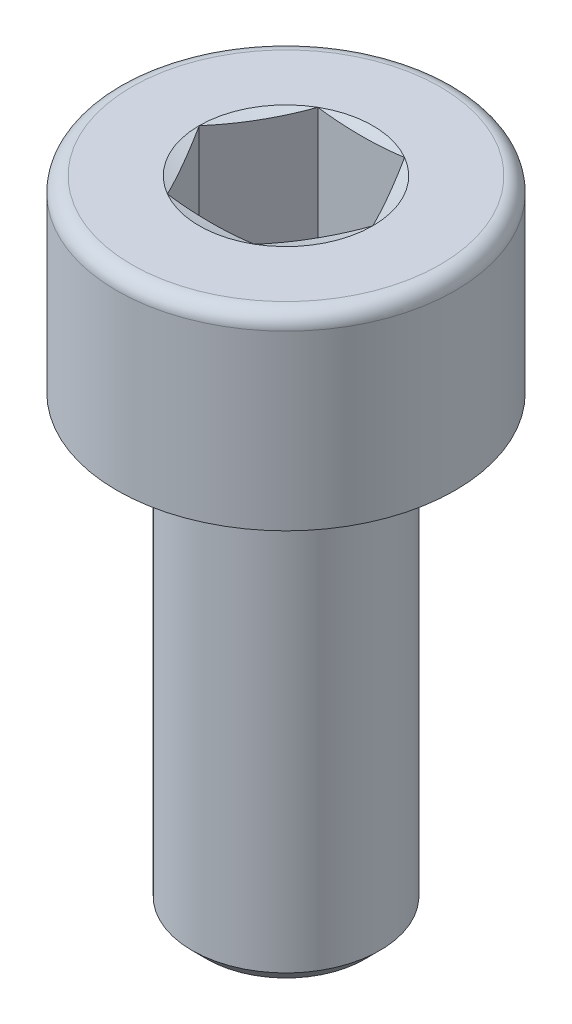
ISO-10303-21;
HEADER;
FILE_DESCRIPTION(('STEP AP214'),'2;1');
FILE_NAME('part.step','',(''),(''),'','','');
FILE_SCHEMA(('AUTOMOTIVE_DESIGN { 1 0 10303 214 1 1 1 1 }'));
ENDSEC;
DATA;
#1=APPLICATION_CONTEXT('core data for automotive mechanical design processes');
#2=APPLICATION_PROTOCOL_DEFINITION('international standard','automotive_design',2000,#1);
#3=PRODUCT_CONTEXT('',#1,'mechanical');
#4=PRODUCT('Part','Part','',(#3));
#5=PRODUCT_RELATED_PRODUCT_CATEGORY('part','',(#4));
#6=PRODUCT_DEFINITION_FORMATION('','',#4);
#7=PRODUCT_DEFINITION_CONTEXT('part definition',#1,'design');
#8=PRODUCT_DEFINITION('design','',#6,#7);
#9=PRODUCT_DEFINITION_SHAPE('','',#8);
#10=(LENGTH_UNIT() NAMED_UNIT(*) SI_UNIT(.MILLI.,.METRE.));
#11=(NAMED_UNIT(*) PLANE_ANGLE_UNIT() SI_UNIT($,.RADIAN.));
#12=(NAMED_UNIT(*) SI_UNIT($,.STERADIAN.) SOLID_ANGLE_UNIT());
#13=UNCERTAINTY_MEASURE_WITH_UNIT(LENGTH_MEASURE(1.E-05),#10,'distance_accuracy_value','');
#14=(GEOMETRIC_REPRESENTATION_CONTEXT(3) GLOBAL_UNCERTAINTY_ASSIGNED_CONTEXT((#13)) GLOBAL_UNIT_ASSIGNED_CONTEXT((#10,
#11,#12)) REPRESENTATION_CONTEXT('',''));
#15=CARTESIAN_POINT('',(0.,0.,0.));
#16=DIRECTION('',(0.,0.,1.));
#17=DIRECTION('',(1.,0.,0.));
#18=AXIS2_PLACEMENT_3D('',#15,#16,#17);
#19=CARTESIAN_POINT('',(-0.577350269189626,0.5,1.));
#20=DIRECTION('',(-0.866025403784439,0.,0.5));
#21=DIRECTION('',(0.5,0.,0.866025403784439));
#22=AXIS2_PLACEMENT_3D('',#19,#20,#21);
#23=PLANE('',#22);
#24=CARTESIAN_POINT('',(-0.577350269189626,2.5,1.));
#25=CARTESIAN_POINT('',(-0.602256905546369,2.4928156948734,0.956860440384478));
#26=CARTESIAN_POINT('',(-0.627233209396661,2.48665993251672,0.913600213130495));
#27=CARTESIAN_POINT('',(-0.677282869012062,2.47629629733561,0.826911659775093));
#28=CARTESIAN_POINT('',(-0.702356208114864,2.47208810385436,0.783483362533635));
#29=CARTESIAN_POINT('',(-0.777414647875531,2.46225168137474,0.653478331331313));
#30=CARTESIAN_POINT('',(-0.827492964204296,2.45934068378329,0.566740143092384));
#31=CARTESIAN_POINT('',(-0.923802752789168,2.46037348534467,0.399926695997169));
#32=CARTESIAN_POINT('',(-0.970035820593886,2.46381057241938,0.319848673569621));
#33=CARTESIAN_POINT('',(-1.03932177179707,2.47367744547349,0.199841885834972));
#34=CARTESIAN_POINT('',(-1.0624605054686,2.47776673103799,0.159764423493068));
#35=CARTESIAN_POINT('',(-1.10865304075022,2.48761182938245,0.0797566054548838));
#36=CARTESIAN_POINT('',(-1.13170682656885,2.49336793760975,0.0398262771102067));
#37=CARTESIAN_POINT('',(-1.15470053837925,2.5,0.));
#38=B_SPLINE_CURVE_WITH_KNOTS('',3,(#24,#25,#26,#27,#28,#29,#30,#31,#32,#33,#34,#35,#36,#37),
.UNSPECIFIED.,.F.,.F.,(4,2,2,2,2,2,4),(0.,0.150960283418929,0.3018957031821,0.602226966634645,
0.879613062899962,1.01895925678016,1.15833016516169),.UNSPECIFIED.);
#39=CARTESIAN_POINT('',(-0.577350269189627,2.5,0.999999999999998));
#40=VERTEX_POINT('',#39);
#41=CARTESIAN_POINT('',(-1.15470053837925,2.5,0.));
#42=VERTEX_POINT('',#41);
#43=EDGE_CURVE('E80',#40,#42,#38,.T.);
#44=ORIENTED_EDGE('',*,*,#43,.F.);
#45=DIRECTION('',(0.,1.,0.));
#46=VECTOR('',#45,1.);
#47=CARTESIAN_POINT('',(-0.577350269189626,0.5,1.));
#48=LINE('',#47,#46);
#49=CARTESIAN_POINT('',(-0.577350269189626,0.5,1.));
#50=VERTEX_POINT('',#49);
#51=EDGE_CURVE('E116',#40,#50,#48,.F.);
#52=ORIENTED_EDGE('',*,*,#51,.T.);
#53=DIRECTION('',(0.5,0.,0.866025403784439));
#54=VECTOR('',#53,1.);
#55=CARTESIAN_POINT('',(-0.577350269189626,0.5,1.));
#56=LINE('',#55,#54);
#57=CARTESIAN_POINT('',(-1.15470053837925,0.5,0.));
#58=VERTEX_POINT('',#57);
#59=EDGE_CURVE('E89',#58,#50,#56,.T.);
#60=ORIENTED_EDGE('',*,*,#59,.F.);
#61=DIRECTION('',(0.,1.,0.));
#62=VECTOR('',#61,1.);
#63=CARTESIAN_POINT('',(-1.15470053837925,0.5,0.));
#64=LINE('',#63,#62);
#65=EDGE_CURVE('E88',#58,#42,#64,.T.);
#66=ORIENTED_EDGE('',*,*,#65,.T.);
#67=EDGE_LOOP('',(#44,#52,#60,#66));
#68=FACE_BOUND('',#67,.T.);
#69=ADVANCED_FACE('F16',(#68),#23,.F.);
#70=CARTESIAN_POINT('',(-1.15470053837925,0.5,0.));
#71=DIRECTION('',(-0.866025403784439,0.,-0.5));
#72=DIRECTION('',(-0.5,0.,0.866025403784439));
#73=AXIS2_PLACEMENT_3D('',#70,#71,#72);
#74=PLANE('',#73);
#75=CARTESIAN_POINT('',(-1.15470053837925,2.5,0.));
#76=CARTESIAN_POINT('',(-1.12979390202251,2.4928156948734,-0.0431395596155219));
#77=CARTESIAN_POINT('',(-1.10481759817222,2.48665993251672,-0.086399786869505));
#78=CARTESIAN_POINT('',(-1.05476793855682,2.47629629733561,-0.173088340224907));
#79=CARTESIAN_POINT('',(-1.02969459945401,2.47208810385436,-0.216516637466365));
#80=CARTESIAN_POINT('',(-0.954636159693347,2.46225168137474,-0.346521668668687));
#81=CARTESIAN_POINT('',(-0.904557843364582,2.45934068378329,-0.433259856907615));
#82=CARTESIAN_POINT('',(-0.80824805477971,2.46037348534467,-0.600073304002831));
#83=CARTESIAN_POINT('',(-0.762014986974992,2.46381057241938,-0.680151326430379));
#84=CARTESIAN_POINT('',(-0.69272903577181,2.47367744547349,-0.800158114165028));
#85=CARTESIAN_POINT('',(-0.669590302100274,2.47776673103799,-0.840235576506932));
#86=CARTESIAN_POINT('',(-0.623397766818654,2.48761182938245,-0.920243394545117));
#87=CARTESIAN_POINT('',(-0.600343981000024,2.49336793760975,-0.960173722889794));
#88=CARTESIAN_POINT('',(-0.577350269189626,2.5,-1.));
#89=B_SPLINE_CURVE_WITH_KNOTS('',3,(#75,#76,#77,#78,#79,#80,#81,#82,#83,#84,#85,#86,#87,#88),
.UNSPECIFIED.,.F.,.F.,(4,2,2,2,2,2,4),(0.,0.150960283418929,0.3018957031821,0.602226966634645,
0.879613062899962,1.01895925678016,1.15833016516169),.UNSPECIFIED.);
#90=CARTESIAN_POINT('',(-0.577350269189623,2.5,-1.));
#91=VERTEX_POINT('',#90);
#92=EDGE_CURVE('E95',#42,#91,#89,.T.);
#93=ORIENTED_EDGE('',*,*,#92,.F.);
#94=ORIENTED_EDGE('',*,*,#65,.F.);
#95=DIRECTION('',(0.5,0.,-0.866025403784439));
#96=VECTOR('',#95,1.);
#97=CARTESIAN_POINT('',(-1.15470053837925,0.5,0.));
#98=LINE('',#97,#96);
#99=CARTESIAN_POINT('',(-0.577350269189626,0.5,-1.));
#100=VERTEX_POINT('',#99);
#101=EDGE_CURVE('E227',#58,#100,#98,.T.);
#102=ORIENTED_EDGE('',*,*,#101,.T.);
#103=DIRECTION('',(0.,1.,0.));
#104=VECTOR('',#103,1.);
#105=CARTESIAN_POINT('',(-0.577350269189626,0.5,-1.));
#106=LINE('',#105,#104);
#107=EDGE_CURVE('E114',#100,#91,#106,.T.);
#108=ORIENTED_EDGE('',*,*,#107,.T.);
#109=EDGE_LOOP('',(#93,#94,#102,#108));
#110=FACE_BOUND('',#109,.T.);
#111=ADVANCED_FACE('F112',(#110),#74,.F.);
#112=CARTESIAN_POINT('',(0.577350269189626,0.5,1.));
#113=DIRECTION('',(0.,0.,1.));
#114=DIRECTION('',(1.,0.,0.));
#115=AXIS2_PLACEMENT_3D('',#112,#113,#114);
#116=PLANE('',#115);
#117=CARTESIAN_POINT('',(0.577350269189626,2.5,0.999999999999999));
#118=CARTESIAN_POINT('',(0.527536996476139,2.4928156948734,1.));
#119=CARTESIAN_POINT('',(0.477584388775556,2.48665993251672,1.));
#120=CARTESIAN_POINT('',(0.377485069544755,2.47629629733561,1.));
#121=CARTESIAN_POINT('',(0.327338391339149,2.47208810385436,1.));
#122=CARTESIAN_POINT('',(0.177221511817816,2.46225168137474,1.));
#123=CARTESIAN_POINT('',(0.0770648791602852,2.45934068378329,1.));
#124=CARTESIAN_POINT('',(-0.115554698009459,2.46037348534467,1.));
#125=CARTESIAN_POINT('',(-0.208020833618895,2.46381057241938,1.));
#126=CARTESIAN_POINT('',(-0.346592736025259,2.47367744547349,1.));
#127=CARTESIAN_POINT('',(-0.392870203368329,2.47776673103799,1.));
#128=CARTESIAN_POINT('',(-0.48525527393157,2.48761182938245,1.));
#129=CARTESIAN_POINT('',(-0.531362845568829,2.49336793760975,1.));
#130=CARTESIAN_POINT('',(-0.577350269189626,2.5,1.));
#131=B_SPLINE_CURVE_WITH_KNOTS('',3,(#117,#118,#119,#120,#121,#122,#123,#124,#125,#126,#127,
#128,#129,#130),.UNSPECIFIED.,.F.,.F.,(4,2,2,2,2,2,4),(0.,0.150960283418929,0.3018957031821,
0.602226966634646,0.879613062899963,1.01895925678016,1.15833016516169),.UNSPECIFIED.);
#132=CARTESIAN_POINT('',(0.577350269189623,2.5,1.));
#133=VERTEX_POINT('',#132);
#134=EDGE_CURVE('E74',#133,#40,#131,.T.);
#135=ORIENTED_EDGE('',*,*,#134,.F.);
#136=DIRECTION('',(0.,1.,0.));
#137=VECTOR('',#136,1.);
#138=CARTESIAN_POINT('',(0.577350269189626,0.5,1.));
#139=LINE('',#138,#137);
#140=CARTESIAN_POINT('',(0.577350269189626,0.5,1.));
#141=VERTEX_POINT('',#140);
#142=EDGE_CURVE('E210',#133,#141,#139,.F.);
#143=ORIENTED_EDGE('',*,*,#142,.T.);
#144=DIRECTION('',(1.,0.,0.));
#145=VECTOR('',#144,1.);
#146=CARTESIAN_POINT('',(-0.577350269189626,0.5,1.));
#147=LINE('',#146,#145);
#148=EDGE_CURVE('E231',#141,#50,#147,.F.);
#149=ORIENTED_EDGE('',*,*,#148,.T.);
#150=ORIENTED_EDGE('',*,*,#51,.F.);
#151=EDGE_LOOP('',(#135,#143,#149,#150));
#152=FACE_BOUND('',#151,.T.);
#153=ADVANCED_FACE('F137',(#152),#116,.F.);
#154=CARTESIAN_POINT('',(-0.577350269189626,0.5,-1.));
#155=DIRECTION('',(0.,-1.,0.));
#156=DIRECTION('',(0.,0.,-1.));
#157=AXIS2_PLACEMENT_3D('',#154,#155,#156);
#158=PLANE('',#157);
#159=ORIENTED_EDGE('',*,*,#59,.T.);
#160=ORIENTED_EDGE('',*,*,#148,.F.);
#161=DIRECTION('',(0.5,0.,-0.866025403784438));
#162=VECTOR('',#161,1.);
#163=CARTESIAN_POINT('',(1.15470053837925,0.5,0.));
#164=LINE('',#163,#162);
#165=CARTESIAN_POINT('',(1.15470053837925,0.5,0.));
#166=VERTEX_POINT('',#165);
#167=EDGE_CURVE('E159',#141,#166,#164,.T.);
#168=ORIENTED_EDGE('',*,*,#167,.T.);
#169=DIRECTION('',(-0.5,0.,-0.866025403784439));
#170=VECTOR('',#169,1.);
#171=CARTESIAN_POINT('',(0.577350269189626,0.5,-1.));
#172=LINE('',#171,#170);
#173=CARTESIAN_POINT('',(0.577350269189626,0.5,-1.));
#174=VERTEX_POINT('',#173);
#175=EDGE_CURVE('E207',#166,#174,#172,.T.);
#176=ORIENTED_EDGE('',*,*,#175,.T.);
#177=DIRECTION('',(-1.,0.,0.));
#178=VECTOR('',#177,1.);
#179=CARTESIAN_POINT('',(-0.577350269189626,0.5,-1.));
#180=LINE('',#179,#178);
#181=EDGE_CURVE('E222',#174,#100,#180,.T.);
#182=ORIENTED_EDGE('',*,*,#181,.T.);
#183=ORIENTED_EDGE('',*,*,#101,.F.);
#184=EDGE_LOOP('',(#159,#160,#168,#176,#182,#183));
#185=FACE_BOUND('',#184,.T.);
#186=ADVANCED_FACE('F141',(#185),#158,.F.);
#187=CARTESIAN_POINT('',(-0.577350269189626,0.5,-1.));
#188=DIRECTION('',(0.,0.,-1.));
#189=DIRECTION('',(-1.,0.,0.));
#190=AXIS2_PLACEMENT_3D('',#187,#188,#189);
#191=PLANE('',#190);
#192=CARTESIAN_POINT('',(-0.577350269189626,2.5,-1.));
#193=CARTESIAN_POINT('',(-0.527536996476139,2.4928156948734,-1.));
#194=CARTESIAN_POINT('',(-0.477584388775556,2.48665993251672,-1.));
#195=CARTESIAN_POINT('',(-0.377485069544755,2.47629629733561,-1.));
#196=CARTESIAN_POINT('',(-0.327338391339149,2.47208810385436,-1.));
#197=CARTESIAN_POINT('',(-0.177221511817816,2.46225168137474,-1.));
#198=CARTESIAN_POINT('',(-0.077064879160285,2.45934068378329,-1.));
#199=CARTESIAN_POINT('',(0.11555469800946,2.46037348534467,-1.));
#200=CARTESIAN_POINT('',(0.208020833618896,2.46381057241938,-1.));
#201=CARTESIAN_POINT('',(0.34659273602526,2.47367744547349,-1.));
#202=CARTESIAN_POINT('',(0.39287020336833,2.47776673103799,-1.));
#203=CARTESIAN_POINT('',(0.485255273931571,2.48761182938245,-1.));
#204=CARTESIAN_POINT('',(0.53136284556883,2.49336793760975,-1.));
#205=CARTESIAN_POINT('',(0.577350269189627,2.5,-0.999999999999999));
#206=B_SPLINE_CURVE_WITH_KNOTS('',3,(#192,#193,#194,#195,#196,#197,#198,#199,#200,#201,#202,
#203,#204,#205),.UNSPECIFIED.,.F.,.F.,(4,2,2,2,2,2,4),(0.,0.150960283418929,0.3018957031821,
0.602226966634646,0.879613062899963,1.01895925678016,1.15833016516169),.UNSPECIFIED.);
#207=CARTESIAN_POINT('',(0.577350269189626,2.5,-0.999999999999999));
#208=VERTEX_POINT('',#207);
#209=EDGE_CURVE('E154',#91,#208,#206,.T.);
#210=ORIENTED_EDGE('',*,*,#209,.F.);
#211=ORIENTED_EDGE('',*,*,#107,.F.);
#212=ORIENTED_EDGE('',*,*,#181,.F.);
#213=DIRECTION('',(0.,1.,0.));
#214=VECTOR('',#213,1.);
#215=CARTESIAN_POINT('',(0.577350269189626,0.5,-1.));
#216=LINE('',#215,#214);
#217=EDGE_CURVE('E202',#174,#208,#216,.T.);
#218=ORIENTED_EDGE('',*,*,#217,.T.);
#219=EDGE_LOOP('',(#210,#211,#212,#218));
#220=FACE_BOUND('',#219,.T.);
#221=ADVANCED_FACE('F145',(#220),#191,.F.);
#222=CARTESIAN_POINT('',(1.15470053837925,0.5,0.));
#223=DIRECTION('',(0.866025403784438,0.,0.5));
#224=DIRECTION('',(0.5,0.,-0.866025403784438));
#225=AXIS2_PLACEMENT_3D('',#222,#223,#224);
#226=PLANE('',#225);
#227=CARTESIAN_POINT('',(1.15470053837925,2.5,0.));
#228=CARTESIAN_POINT('',(1.12979390202251,2.4928156948734,0.0431395596155222));
#229=CARTESIAN_POINT('',(1.10481759817222,2.48665993251672,0.0863997868695053));
#230=CARTESIAN_POINT('',(1.05476793855682,2.47629629733561,0.173088340224907));
#231=CARTESIAN_POINT('',(1.02969459945401,2.47208810385436,0.216516637466365));
#232=CARTESIAN_POINT('',(0.954636159693347,2.46225168137474,0.346521668668687));
#233=CARTESIAN_POINT('',(0.904557843364581,2.45934068378329,0.433259856907615));
#234=CARTESIAN_POINT('',(0.808248054779709,2.46037348534467,0.600073304002831));
#235=CARTESIAN_POINT('',(0.762014986974991,2.46381057241938,0.680151326430379));
#236=CARTESIAN_POINT('',(0.692729035771809,2.47367744547349,0.800158114165028));
#237=CARTESIAN_POINT('',(0.669590302100274,2.47776673103799,0.840235576506932));
#238=CARTESIAN_POINT('',(0.623397766818654,2.48761182938245,0.920243394545116));
#239=CARTESIAN_POINT('',(0.600343981000025,2.49336793760975,0.960173722889793));
#240=CARTESIAN_POINT('',(0.577350269189626,2.5,0.999999999999999));
#241=B_SPLINE_CURVE_WITH_KNOTS('',3,(#227,#228,#229,#230,#231,#232,#233,#234,#235,#236,#237,
#238,#239,#240),.UNSPECIFIED.,.F.,.F.,(4,2,2,2,2,2,4),(0.,0.150960283418929,0.3018957031821,
0.602226966634646,0.879613062899962,1.01895925678016,1.15833016516169),.UNSPECIFIED.);
#242=CARTESIAN_POINT('',(1.15470053837925,2.5,0.));
#243=VERTEX_POINT('',#242);
#244=EDGE_CURVE('E160',#243,#133,#241,.T.);
#245=ORIENTED_EDGE('',*,*,#244,.F.);
#246=DIRECTION('',(0.,1.,0.));
#247=VECTOR('',#246,1.);
#248=CARTESIAN_POINT('',(1.15470053837925,0.5,0.));
#249=LINE('',#248,#247);
#250=EDGE_CURVE('E198',#243,#166,#249,.F.);
#251=ORIENTED_EDGE('',*,*,#250,.T.);
#252=ORIENTED_EDGE('',*,*,#167,.F.);
#253=ORIENTED_EDGE('',*,*,#142,.F.);
#254=EDGE_LOOP('',(#245,#251,#252,#253));
#255=FACE_BOUND('',#254,.T.);
#256=ADVANCED_FACE('F150',(#255),#226,.F.);
#257=CARTESIAN_POINT('',(0.577350269189626,0.5,-1.));
#258=DIRECTION('',(0.866025403784439,0.,-0.5));
#259=DIRECTION('',(-0.5,0.,-0.866025403784439));
#260=AXIS2_PLACEMENT_3D('',#257,#258,#259);
#261=PLANE('',#260);
#262=CARTESIAN_POINT('',(1.15470053837925,2.5,0.));
#263=CARTESIAN_POINT('',(1.12979390202251,2.4928156948734,-0.0431395596155219));
#264=CARTESIAN_POINT('',(1.10481759817222,2.48665993251672,-0.0863997868695049));
#265=CARTESIAN_POINT('',(1.05476793855682,2.47629629733561,-0.173088340224907));
#266=CARTESIAN_POINT('',(1.02969459945401,2.47208810385436,-0.216516637466365));
#267=CARTESIAN_POINT('',(0.954636159693347,2.46225168137474,-0.346521668668687));
#268=CARTESIAN_POINT('',(0.904557843364582,2.45934068378329,-0.433259856907615));
#269=CARTESIAN_POINT('',(0.80824805477971,2.46037348534467,-0.600073304002831));
#270=CARTESIAN_POINT('',(0.762014986974991,2.46381057241938,-0.680151326430379));
#271=CARTESIAN_POINT('',(0.69272903577181,2.47367744547349,-0.800158114165028));
#272=CARTESIAN_POINT('',(0.669590302100275,2.47776673103799,-0.840235576506931));
#273=CARTESIAN_POINT('',(0.623397766818654,2.48761182938245,-0.920243394545116));
#274=CARTESIAN_POINT('',(0.600343981000025,2.49336793760975,-0.960173722889793));
#275=CARTESIAN_POINT('',(0.577350269189627,2.5,-0.999999999999999));
#276=B_SPLINE_CURVE_WITH_KNOTS('',3,(#262,#263,#264,#265,#266,#267,#268,#269,#270,#271,#272,
#273,#274,#275),.UNSPECIFIED.,.F.,.F.,(4,2,2,2,2,2,4),(0.,0.150960283418929,0.3018957031821,
0.602226966634645,0.879613062899962,1.01895925678016,1.15833016516169),.UNSPECIFIED.);
#277=EDGE_CURVE('E201',#243,#208,#276,.T.);
#278=ORIENTED_EDGE('',*,*,#277,.T.);
#279=ORIENTED_EDGE('',*,*,#217,.F.);
#280=ORIENTED_EDGE('',*,*,#175,.F.);
#281=ORIENTED_EDGE('',*,*,#250,.F.);
#282=EDGE_LOOP('',(#278,#279,#280,#281));
#283=FACE_BOUND('',#282,.T.);
#284=ADVANCED_FACE('F193',(#283),#261,.F.);
#285=CARTESIAN_POINT('',(-0.323386652483568,5.38251924939228,0.));
#286=DIRECTION('',(0.,0.,1.));
#287=DIRECTION('',(-1.,0.,0.));
#288=AXIS2_PLACEMENT_3D('',#285,#286,#287);
#289=CIRCLE('',#288,3.);
#290=TRIMMED_CURVE('',#289,(PARAMETER_VALUE(-1.67880173874616)),
(PARAMETER_VALUE(1.67880173874616)),.T.,.PARAMETER.);
#291=CARTESIAN_POINT('',(0.,5.38251924939228,0.));
#292=DIRECTION('',(0.,1.,0.));
#293=AXIS1_PLACEMENT('',#291,#292);
#294=SURFACE_OF_REVOLUTION('',#290,#293);
#295=ORIENTED_EDGE('',*,*,#244,.T.);
#296=CARTESIAN_POINT('',(0.,2.5,0.));
#297=DIRECTION('',(0.,1.,0.));
#298=DIRECTION('',(-1.,0.,0.));
#299=AXIS2_PLACEMENT_3D('',#296,#297,#298);
#300=CIRCLE('',#299,1.15470053837925);
#301=EDGE_CURVE('E258',#243,#133,#300,.F.);
#302=ORIENTED_EDGE('',*,*,#301,.F.);
#303=EDGE_LOOP('',(#295,#302));
#304=FACE_BOUND('',#303,.T.);
#305=ADVANCED_FACE('F190',(#304),#294,.T.);
#306=CARTESIAN_POINT('',(-0.323386652483568,5.38251924939228,0.));
#307=DIRECTION('',(0.,0.,1.));
#308=DIRECTION('',(-1.,0.,0.));
#309=AXIS2_PLACEMENT_3D('',#306,#307,#308);
#310=CIRCLE('',#309,3.);
#311=TRIMMED_CURVE('',#310,(PARAMETER_VALUE(-1.67880173874616)),
(PARAMETER_VALUE(1.67880173874616)),.T.,.PARAMETER.);
#312=CARTESIAN_POINT('',(0.,5.38251924939228,0.));
#313=DIRECTION('',(0.,1.,0.));
#314=AXIS1_PLACEMENT('',#312,#313);
#315=SURFACE_OF_REVOLUTION('',#311,#314);
#316=ORIENTED_EDGE('',*,*,#134,.T.);
#317=CARTESIAN_POINT('',(0.,2.5,0.));
#318=DIRECTION('',(0.,1.,0.));
#319=DIRECTION('',(-1.,0.,0.));
#320=AXIS2_PLACEMENT_3D('',#317,#318,#319);
#321=CIRCLE('',#320,1.15470053837925);
#322=EDGE_CURVE('E105',#133,#40,#321,.F.);
#323=ORIENTED_EDGE('',*,*,#322,.F.);
#324=EDGE_LOOP('',(#316,#323));
#325=FACE_BOUND('',#324,.T.);
#326=ADVANCED_FACE('F187',(#325),#315,.T.);
#327=CARTESIAN_POINT('',(-0.323386652483568,5.38251924939228,0.));
#328=DIRECTION('',(0.,0.,1.));
#329=DIRECTION('',(-1.,0.,0.));
#330=AXIS2_PLACEMENT_3D('',#327,#328,#329);
#331=CIRCLE('',#330,3.);
#332=TRIMMED_CURVE('',#331,(PARAMETER_VALUE(-1.67880173874616)),
(PARAMETER_VALUE(1.67880173874616)),.T.,.PARAMETER.);
#333=CARTESIAN_POINT('',(0.,5.38251924939228,0.));
#334=DIRECTION('',(0.,1.,0.));
#335=AXIS1_PLACEMENT('',#333,#334);
#336=SURFACE_OF_REVOLUTION('',#332,#335);
#337=ORIENTED_EDGE('',*,*,#43,.T.);
#338=CARTESIAN_POINT('',(0.,2.5,0.));
#339=DIRECTION('',(0.,1.,0.));
#340=DIRECTION('',(-1.,0.,0.));
#341=AXIS2_PLACEMENT_3D('',#338,#339,#340);
#342=CIRCLE('',#341,1.15470053837925);
#343=EDGE_CURVE('E84',#40,#42,#342,.F.);
#344=ORIENTED_EDGE('',*,*,#343,.F.);
#345=EDGE_LOOP('',(#337,#344));
#346=FACE_BOUND('',#345,.T.);
#347=ADVANCED_FACE('F82',(#346),#336,.T.);
#348=CARTESIAN_POINT('',(-0.323386652483568,5.38251924939228,0.));
#349=DIRECTION('',(0.,0.,1.));
#350=DIRECTION('',(-1.,0.,0.));
#351=AXIS2_PLACEMENT_3D('',#348,#349,#350);
#352=CIRCLE('',#351,3.);
#353=TRIMMED_CURVE('',#352,(PARAMETER_VALUE(-1.67880173874616)),
(PARAMETER_VALUE(1.67880173874616)),.T.,.PARAMETER.);
#354=CARTESIAN_POINT('',(0.,5.38251924939228,0.));
#355=DIRECTION('',(0.,1.,0.));
#356=AXIS1_PLACEMENT('',#354,#355);
#357=SURFACE_OF_REVOLUTION('',#353,#356);
#358=ORIENTED_EDGE('',*,*,#92,.T.);
#359=CARTESIAN_POINT('',(0.,2.5,0.));
#360=DIRECTION('',(0.,1.,0.));
#361=DIRECTION('',(-1.,0.,0.));
#362=AXIS2_PLACEMENT_3D('',#359,#360,#361);
#363=CIRCLE('',#362,1.15470053837925);
#364=EDGE_CURVE('E102',#42,#91,#363,.F.);
#365=ORIENTED_EDGE('',*,*,#364,.F.);
#366=EDGE_LOOP('',(#358,#365));
#367=FACE_BOUND('',#366,.T.);
#368=ADVANCED_FACE('F108',(#367),#357,.T.);
#369=CARTESIAN_POINT('',(-0.323386652483568,5.38251924939228,0.));
#370=DIRECTION('',(0.,0.,1.));
#371=DIRECTION('',(-1.,0.,0.));
#372=AXIS2_PLACEMENT_3D('',#369,#370,#371);
#373=CIRCLE('',#372,3.);
#374=TRIMMED_CURVE('',#373,(PARAMETER_VALUE(-1.67880173874616)),
(PARAMETER_VALUE(1.67880173874616)),.T.,.PARAMETER.);
#375=CARTESIAN_POINT('',(0.,5.38251924939228,0.));
#376=DIRECTION('',(0.,1.,0.));
#377=AXIS1_PLACEMENT('',#375,#376);
#378=SURFACE_OF_REVOLUTION('',#374,#377);
#379=ORIENTED_EDGE('',*,*,#209,.T.);
#380=CARTESIAN_POINT('',(0.,2.5,0.));
#381=DIRECTION('',(0.,1.,0.));
#382=DIRECTION('',(-1.,0.,0.));
#383=AXIS2_PLACEMENT_3D('',#380,#381,#382);
#384=CIRCLE('',#383,1.15470053837925);
#385=EDGE_CURVE('E110',#91,#208,#384,.F.);
#386=ORIENTED_EDGE('',*,*,#385,.F.);
#387=EDGE_LOOP('',(#379,#386));
#388=FACE_BOUND('',#387,.T.);
#389=ADVANCED_FACE('F166',(#388),#378,.T.);
#390=CARTESIAN_POINT('',(-0.323386652483568,5.38251924939228,0.));
#391=DIRECTION('',(0.,0.,1.));
#392=DIRECTION('',(-1.,0.,0.));
#393=AXIS2_PLACEMENT_3D('',#390,#391,#392);
#394=CIRCLE('',#393,3.);
#395=TRIMMED_CURVE('',#394,(PARAMETER_VALUE(-1.67880173874616)),
(PARAMETER_VALUE(1.67880173874616)),.T.,.PARAMETER.);
#396=CARTESIAN_POINT('',(0.,5.38251924939228,0.));
#397=DIRECTION('',(0.,1.,0.));
#398=AXIS1_PLACEMENT('',#396,#397);
#399=SURFACE_OF_REVOLUTION('',#395,#398);
#400=ORIENTED_EDGE('',*,*,#277,.F.);
#401=CARTESIAN_POINT('',(0.,2.5,0.));
#402=DIRECTION('',(0.,1.,0.));
#403=DIRECTION('',(-1.,0.,0.));
#404=AXIS2_PLACEMENT_3D('',#401,#402,#403);
#405=CIRCLE('',#404,1.15470053837925);
#406=EDGE_CURVE('E253',#208,#243,#405,.F.);
#407=ORIENTED_EDGE('',*,*,#406,.F.);
#408=EDGE_LOOP('',(#400,#407));
#409=FACE_BOUND('',#408,.T.);
#410=ADVANCED_FACE('F171',(#409),#399,.T.);
#411=CARTESIAN_POINT('',(0.,2.5,0.));
#412=DIRECTION('',(0.,1.,0.));
#413=DIRECTION('',(0.,0.,1.));
#414=AXIS2_PLACEMENT_3D('',#411,#412,#413);
#415=PLANE('',#414);
#416=CARTESIAN_POINT('',(0.,2.5,0.));
#417=DIRECTION('',(0.,-1.,0.));
#418=DIRECTION('',(0.,0.,-1.));
#419=AXIS2_PLACEMENT_3D('',#416,#417,#418);
#420=CIRCLE('',#419,2.05);
#421=CARTESIAN_POINT('',(0.,2.5,-2.05));
#422=VERTEX_POINT('',#421);
#423=CARTESIAN_POINT('',(0.,2.5,2.05));
#424=VERTEX_POINT('',#423);
#425=EDGE_CURVE('E36',#422,#424,#420,.T.);
#426=ORIENTED_EDGE('',*,*,#425,.F.);
#427=CARTESIAN_POINT('',(0.,2.5,0.));
#428=DIRECTION('',(0.,-1.,0.));
#429=DIRECTION('',(0.,0.,1.));
#430=AXIS2_PLACEMENT_3D('',#427,#428,#429);
#431=CIRCLE('',#430,2.05);
#432=EDGE_CURVE('E326',#424,#422,#431,.T.);
#433=ORIENTED_EDGE('',*,*,#432,.F.);
#434=EDGE_LOOP('',(#426,#433));
#435=FACE_BOUND('',#434,.T.);
#436=ORIENTED_EDGE('',*,*,#385,.T.);
#437=ORIENTED_EDGE('',*,*,#406,.T.);
#438=ORIENTED_EDGE('',*,*,#301,.T.);
#439=ORIENTED_EDGE('',*,*,#322,.T.);
#440=ORIENTED_EDGE('',*,*,#343,.T.);
#441=ORIENTED_EDGE('',*,*,#364,.T.);
#442=EDGE_LOOP('',(#436,#437,#438,#439,#440,#441));
#443=FACE_BOUND('',#442,.T.);
#444=ADVANCED_FACE('F101',(#435,#443),#415,.T.);
#445=CARTESIAN_POINT('',(0.,2.3,0.));
#446=DIRECTION('',(0.,1.,0.));
#447=DIRECTION('',(0.,0.,1.));
#448=AXIS2_PLACEMENT_3D('',#445,#446,#447);
#449=TOROIDAL_SURFACE('',#448,2.05,0.2);
#450=CARTESIAN_POINT('',(0.,2.3,0.));
#451=DIRECTION('',(0.,-1.,0.));
#452=DIRECTION('',(0.,0.,-1.));
#453=AXIS2_PLACEMENT_3D('',#450,#451,#452);
#454=CIRCLE('',#453,2.25);
#455=CARTESIAN_POINT('',(0.,2.3,-2.25));
#456=VERTEX_POINT('',#455);
#457=EDGE_CURVE('E252',#456,#456,#454,.T.);
#458=ORIENTED_EDGE('',*,*,#457,.F.);
#459=EDGE_LOOP('',(#458));
#460=FACE_BOUND('',#459,.T.);
#461=ORIENTED_EDGE('',*,*,#432,.T.);
#462=ORIENTED_EDGE('',*,*,#425,.T.);
#463=EDGE_LOOP('',(#461,#462));
#464=FACE_BOUND('',#463,.T.);
#465=ADVANCED_FACE('F303',(#460,#464),#449,.T.);
#466=CARTESIAN_POINT('',(0.,-6.,0.));
#467=DIRECTION('',(0.,-1.,0.));
#468=DIRECTION('',(0.,0.,-1.));
#469=AXIS2_PLACEMENT_3D('',#466,#467,#468);
#470=PLANE('',#469);
#471=CARTESIAN_POINT('',(0.,-6.00000000002865,0.));
#472=DIRECTION('',(0.,1.,0.));
#473=DIRECTION('',(0.,0.,1.));
#474=AXIS2_PLACEMENT_3D('',#471,#472,#473);
#475=CIRCLE('',#474,1.05000000002065);
#476=CARTESIAN_POINT('',(0.,-6.00000000002865,1.05000000002065));
#477=VERTEX_POINT('',#476);
#478=EDGE_CURVE('E249',#477,#477,#475,.T.);
#479=ORIENTED_EDGE('',*,*,#478,.F.);
#480=EDGE_LOOP('',(#479));
#481=FACE_BOUND('',#480,.T.);
#482=ADVANCED_FACE('F300',(#481),#470,.T.);
#483=CARTESIAN_POINT('',(0.,2.5,0.));
#484=DIRECTION('',(0.,-1.,0.));
#485=DIRECTION('',(0.,0.,-1.));
#486=AXIS2_PLACEMENT_3D('',#483,#484,#485);
#487=CYLINDRICAL_SURFACE('',#486,2.25);
#488=ORIENTED_EDGE('',*,*,#457,.T.);
#489=EDGE_LOOP('',(#488));
#490=FACE_BOUND('',#489,.T.);
#491=CARTESIAN_POINT('',(0.,0.,0.));
#492=DIRECTION('',(0.,-1.,0.));
#493=DIRECTION('',(0.,0.,-1.));
#494=AXIS2_PLACEMENT_3D('',#491,#492,#493);
#495=CIRCLE('',#494,2.25);
#496=CARTESIAN_POINT('',(0.,0.,-2.25));
#497=VERTEX_POINT('',#496);
#498=EDGE_CURVE('E246',#497,#497,#495,.F.);
#499=ORIENTED_EDGE('',*,*,#498,.T.);
#500=EDGE_LOOP('',(#499));
#501=FACE_BOUND('',#500,.T.);
#502=ADVANCED_FACE('F296',(#490,#501),#487,.T.);
#503=CARTESIAN_POINT('',(0.,-5.80000000007885,0.));
#504=DIRECTION('',(0.,1.,0.));
#505=DIRECTION('',(0.,0.,1.));
#506=AXIS2_PLACEMENT_3D('',#503,#504,#505);
#507=CONICAL_SURFACE('',#506,1.2499999999136,0.78539816325534);
#508=CARTESIAN_POINT('',(0.,-5.8,0.));
#509=DIRECTION('',(0.,1.,0.));
#510=DIRECTION('',(0.,0.,1.));
#511=AXIS2_PLACEMENT_3D('',#508,#509,#510);
#512=CIRCLE('',#511,1.25);
#513=CARTESIAN_POINT('',(0.,-5.8,1.25));
#514=VERTEX_POINT('',#513);
#515=EDGE_CURVE('E28',#514,#514,#512,.T.);
#516=ORIENTED_EDGE('',*,*,#515,.F.);
#517=EDGE_LOOP('',(#516));
#518=FACE_BOUND('',#517,.T.);
#519=ORIENTED_EDGE('',*,*,#478,.T.);
#520=EDGE_LOOP('',(#519));
#521=FACE_BOUND('',#520,.T.);
#522=ADVANCED_FACE('F289',(#518,#521),#507,.T.);
#523=CARTESIAN_POINT('',(0.,0.,0.));
#524=DIRECTION('',(0.,1.,0.));
#525=DIRECTION('',(0.,0.,1.));
#526=AXIS2_PLACEMENT_3D('',#523,#524,#525);
#527=PLANE('',#526);
#528=CARTESIAN_POINT('',(0.,0.,0.));
#529=DIRECTION('',(0.,1.,0.));
#530=DIRECTION('',(0.,0.,1.));
#531=AXIS2_PLACEMENT_3D('',#528,#529,#530);
#532=CIRCLE('',#531,1.25);
#533=CARTESIAN_POINT('',(0.,0.,1.25));
#534=VERTEX_POINT('',#533);
#535=EDGE_CURVE('E10',#534,#534,#532,.F.);
#536=ORIENTED_EDGE('',*,*,#535,.F.);
#537=EDGE_LOOP('',(#536));
#538=FACE_BOUND('',#537,.T.);
#539=ORIENTED_EDGE('',*,*,#498,.F.);
#540=EDGE_LOOP('',(#539));
#541=FACE_BOUND('',#540,.T.);
#542=ADVANCED_FACE('F283',(#538,#541),#527,.F.);
#543=CARTESIAN_POINT('',(0.,-6.,0.));
#544=DIRECTION('',(0.,1.,0.));
#545=DIRECTION('',(0.,0.,1.));
#546=AXIS2_PLACEMENT_3D('',#543,#544,#545);
#547=CYLINDRICAL_SURFACE('',#546,1.25);
#548=ORIENTED_EDGE('',*,*,#535,.T.);
#549=EDGE_LOOP('',(#548));
#550=FACE_BOUND('',#549,.T.);
#551=ORIENTED_EDGE('',*,*,#515,.T.);
#552=EDGE_LOOP('',(#551));
#553=FACE_BOUND('',#552,.T.);
#554=ADVANCED_FACE('F281',(#550,#553),#547,.T.);
#555=CLOSED_SHELL('',(#69,#111,#153,#186,#221,#256,#284,#305,#326,#347,#368,#389,#410,#444,#465,
#482,#502,#522,#542,#554));
#556=MANIFOLD_SOLID_BREP('B1',#555);
#557=ADVANCED_BREP_SHAPE_REPRESENTATION('',(#18,#556),#14);
#558=SHAPE_DEFINITION_REPRESENTATION(#9,#557);
ENDSEC;
END-ISO-10303-21;
